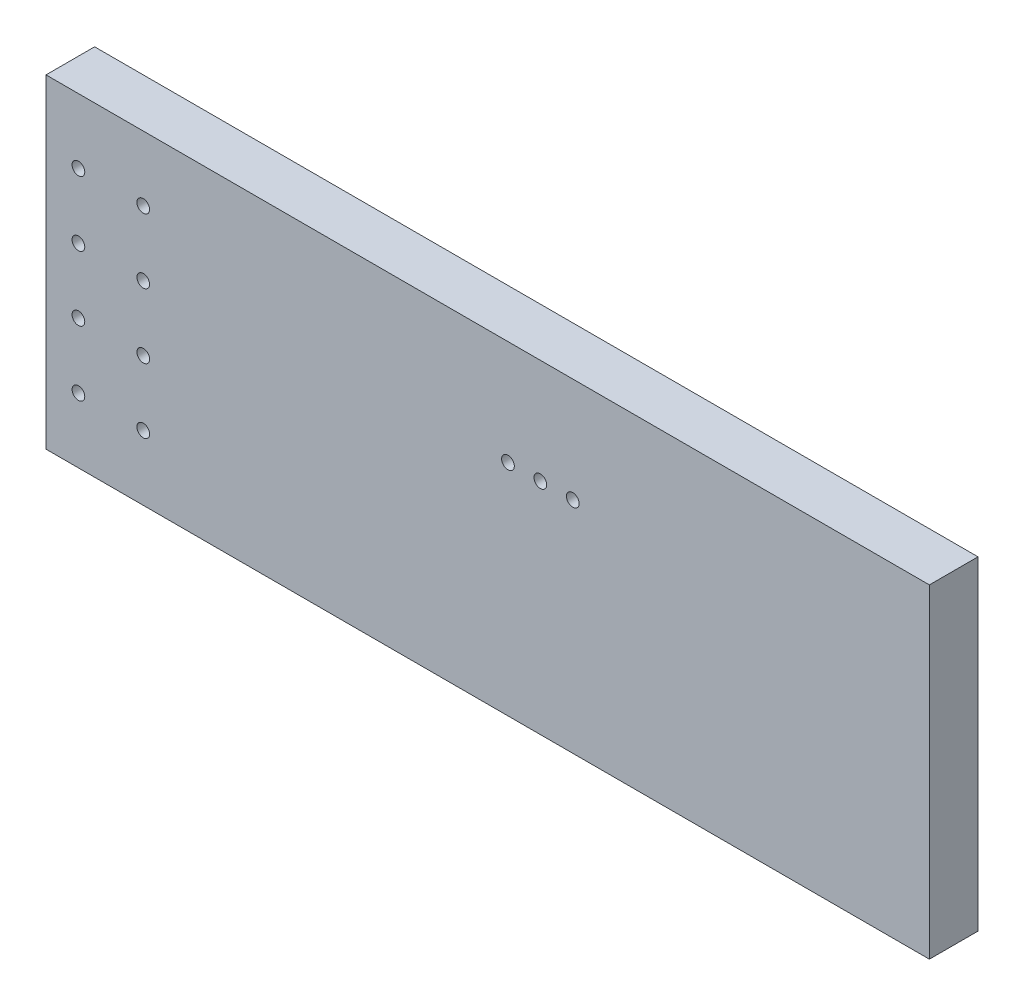
ISO-10303-21;
HEADER;
FILE_DESCRIPTION(('STEP AP214'),'2;1');
FILE_NAME('part.step','',(''),(''),'','','');
FILE_SCHEMA(('AUTOMOTIVE_DESIGN { 1 0 10303 214 1 1 1 1 }'));
ENDSEC;
DATA;
#1=APPLICATION_CONTEXT('core data for automotive mechanical design processes');
#2=APPLICATION_PROTOCOL_DEFINITION('international standard','automotive_design',2000,#1);
#3=PRODUCT_CONTEXT('',#1,'mechanical');
#4=PRODUCT('Part','Part','',(#3));
#5=PRODUCT_RELATED_PRODUCT_CATEGORY('part','',(#4));
#6=PRODUCT_DEFINITION_FORMATION('','',#4);
#7=PRODUCT_DEFINITION_CONTEXT('part definition',#1,'design');
#8=PRODUCT_DEFINITION('design','',#6,#7);
#9=PRODUCT_DEFINITION_SHAPE('','',#8);
#10=(LENGTH_UNIT() NAMED_UNIT(*) SI_UNIT(.MILLI.,.METRE.));
#11=(NAMED_UNIT(*) PLANE_ANGLE_UNIT() SI_UNIT($,.RADIAN.));
#12=(NAMED_UNIT(*) SI_UNIT($,.STERADIAN.) SOLID_ANGLE_UNIT());
#13=UNCERTAINTY_MEASURE_WITH_UNIT(LENGTH_MEASURE(1.E-05),#10,'distance_accuracy_value','');
#14=(GEOMETRIC_REPRESENTATION_CONTEXT(3) GLOBAL_UNCERTAINTY_ASSIGNED_CONTEXT((#13)) GLOBAL_UNIT_ASSIGNED_CONTEXT((#10,
#11,#12)) REPRESENTATION_CONTEXT('',''));
#15=CARTESIAN_POINT('',(0.,0.,0.));
#16=DIRECTION('',(0.,0.,1.));
#17=DIRECTION('',(1.,0.,0.));
#18=AXIS2_PLACEMENT_3D('',#15,#16,#17);
#19=CARTESIAN_POINT('',(0.,0.,19.05));
#20=DIRECTION('',(0.,1.,0.));
#21=DIRECTION('',(0.,0.,1.));
#22=AXIS2_PLACEMENT_3D('',#19,#20,#21);
#23=PLANE('',#22);
#24=DIRECTION('',(1.,0.,0.));
#25=VECTOR('',#24,1.);
#26=CARTESIAN_POINT('',(0.,0.,0.));
#27=LINE('',#26,#25);
#28=CARTESIAN_POINT('',(0.,0.,0.));
#29=VERTEX_POINT('',#28);
#30=CARTESIAN_POINT('',(346.075,0.,0.));
#31=VERTEX_POINT('',#30);
#32=EDGE_CURVE('E83',#29,#31,#27,.T.);
#33=ORIENTED_EDGE('',*,*,#32,.T.);
#34=DIRECTION('',(0.,0.,1.));
#35=VECTOR('',#34,1.);
#36=CARTESIAN_POINT('',(346.075,0.,0.));
#37=LINE('',#36,#35);
#38=CARTESIAN_POINT('',(346.075,0.,19.05));
#39=VERTEX_POINT('',#38);
#40=EDGE_CURVE('E63',#31,#39,#37,.T.);
#41=ORIENTED_EDGE('',*,*,#40,.T.);
#42=DIRECTION('',(1.,0.,0.));
#43=VECTOR('',#42,1.);
#44=CARTESIAN_POINT('',(0.,0.,19.05));
#45=LINE('',#44,#43);
#46=CARTESIAN_POINT('',(0.,0.,19.05));
#47=VERTEX_POINT('',#46);
#48=EDGE_CURVE('E85',#47,#39,#45,.T.);
#49=ORIENTED_EDGE('',*,*,#48,.F.);
#50=DIRECTION('',(0.,0.,-1.));
#51=VECTOR('',#50,1.);
#52=CARTESIAN_POINT('',(0.,0.,19.05));
#53=LINE('',#52,#51);
#54=EDGE_CURVE('E55',#47,#29,#53,.T.);
#55=ORIENTED_EDGE('',*,*,#54,.T.);
#56=EDGE_LOOP('',(#33,#41,#49,#55));
#57=FACE_BOUND('',#56,.T.);
#58=ADVANCED_FACE('F46',(#57),#23,.F.);
#59=CARTESIAN_POINT('',(0.,127.,19.05));
#60=DIRECTION('',(0.,1.,0.));
#61=DIRECTION('',(0.,0.,1.));
#62=AXIS2_PLACEMENT_3D('',#59,#60,#61);
#63=PLANE('',#62);
#64=DIRECTION('',(0.,0.,1.));
#65=VECTOR('',#64,1.);
#66=CARTESIAN_POINT('',(346.075,127.,0.));
#67=LINE('',#66,#65);
#68=CARTESIAN_POINT('',(346.075,127.,0.));
#69=VERTEX_POINT('',#68);
#70=CARTESIAN_POINT('',(346.075,127.,19.05));
#71=VERTEX_POINT('',#70);
#72=EDGE_CURVE('E243',#69,#71,#67,.T.);
#73=ORIENTED_EDGE('',*,*,#72,.F.);
#74=DIRECTION('',(1.,0.,0.));
#75=VECTOR('',#74,1.);
#76=CARTESIAN_POINT('',(0.,127.,0.));
#77=LINE('',#76,#75);
#78=CARTESIAN_POINT('',(0.,127.,0.));
#79=VERTEX_POINT('',#78);
#80=EDGE_CURVE('E97',#79,#69,#77,.T.);
#81=ORIENTED_EDGE('',*,*,#80,.F.);
#82=DIRECTION('',(0.,0.,-1.));
#83=VECTOR('',#82,1.);
#84=CARTESIAN_POINT('',(0.,127.,19.05));
#85=LINE('',#84,#83);
#86=CARTESIAN_POINT('',(0.,127.,19.05));
#87=VERTEX_POINT('',#86);
#88=EDGE_CURVE('E11',#87,#79,#85,.T.);
#89=ORIENTED_EDGE('',*,*,#88,.F.);
#90=DIRECTION('',(1.,0.,0.));
#91=VECTOR('',#90,1.);
#92=CARTESIAN_POINT('',(0.,127.,19.05));
#93=LINE('',#92,#91);
#94=EDGE_CURVE('E106',#87,#71,#93,.T.);
#95=ORIENTED_EDGE('',*,*,#94,.T.);
#96=EDGE_LOOP('',(#73,#81,#89,#95));
#97=FACE_BOUND('',#96,.T.);
#98=ADVANCED_FACE('F165',(#97),#63,.T.);
#99=CARTESIAN_POINT('',(0.,0.,19.05));
#100=DIRECTION('',(-1.,0.,0.));
#101=DIRECTION('',(0.,0.,1.));
#102=AXIS2_PLACEMENT_3D('',#99,#100,#101);
#103=PLANE('',#102);
#104=DIRECTION('',(0.,1.,0.));
#105=VECTOR('',#104,1.);
#106=CARTESIAN_POINT('',(0.,0.,0.));
#107=LINE('',#106,#105);
#108=EDGE_CURVE('E94',#29,#79,#107,.T.);
#109=ORIENTED_EDGE('',*,*,#108,.F.);
#110=ORIENTED_EDGE('',*,*,#54,.F.);
#111=DIRECTION('',(0.,1.,0.));
#112=VECTOR('',#111,1.);
#113=CARTESIAN_POINT('',(0.,0.,19.05));
#114=LINE('',#113,#112);
#115=EDGE_CURVE('E88',#47,#87,#114,.T.);
#116=ORIENTED_EDGE('',*,*,#115,.T.);
#117=ORIENTED_EDGE('',*,*,#88,.T.);
#118=EDGE_LOOP('',(#109,#110,#116,#117));
#119=FACE_BOUND('',#118,.T.);
#120=ADVANCED_FACE('F99',(#119),#103,.T.);
#121=CARTESIAN_POINT('',(0.,0.,19.05));
#122=DIRECTION('',(0.,0.,1.));
#123=DIRECTION('',(1.,0.,0.));
#124=AXIS2_PLACEMENT_3D('',#121,#122,#123);
#125=PLANE('',#124);
#126=DIRECTION('',(0.,-1.,0.));
#127=VECTOR('',#126,1.);
#128=CARTESIAN_POINT('',(346.075,127.,19.05));
#129=LINE('',#128,#127);
#130=EDGE_CURVE('E241',#71,#39,#129,.T.);
#131=ORIENTED_EDGE('',*,*,#130,.F.);
#132=ORIENTED_EDGE('',*,*,#94,.F.);
#133=ORIENTED_EDGE('',*,*,#115,.F.);
#134=ORIENTED_EDGE('',*,*,#48,.T.);
#135=EDGE_LOOP('',(#131,#132,#133,#134));
#136=FACE_BOUND('',#135,.T.);
#137=CARTESIAN_POINT('',(180.975,85.979,19.05));
#138=DIRECTION('',(0.,0.,1.));
#139=DIRECTION('',(1.,0.,0.));
#140=AXIS2_PLACEMENT_3D('',#137,#138,#139);
#141=CIRCLE('',#140,2.4892);
#142=CARTESIAN_POINT('',(183.4642,85.979,19.05));
#143=VERTEX_POINT('',#142);
#144=EDGE_CURVE('E263',#143,#143,#141,.T.);
#145=ORIENTED_EDGE('',*,*,#144,.F.);
#146=EDGE_LOOP('',(#145));
#147=FACE_BOUND('',#146,.T.);
#148=CARTESIAN_POINT('',(193.675,85.979,19.05));
#149=DIRECTION('',(0.,0.,1.));
#150=DIRECTION('',(1.,0.,0.));
#151=AXIS2_PLACEMENT_3D('',#148,#149,#150);
#152=CIRCLE('',#151,2.4892);
#153=CARTESIAN_POINT('',(196.1642,85.979,19.05));
#154=VERTEX_POINT('',#153);
#155=EDGE_CURVE('E267',#154,#154,#152,.T.);
#156=ORIENTED_EDGE('',*,*,#155,.F.);
#157=EDGE_LOOP('',(#156));
#158=FACE_BOUND('',#157,.T.);
#159=CARTESIAN_POINT('',(206.375,85.979,19.05));
#160=DIRECTION('',(0.,0.,1.));
#161=DIRECTION('',(1.,0.,0.));
#162=AXIS2_PLACEMENT_3D('',#159,#160,#161);
#163=CIRCLE('',#162,2.4892);
#164=CARTESIAN_POINT('',(208.8642,85.979,19.05));
#165=VERTEX_POINT('',#164);
#166=EDGE_CURVE('E275',#165,#165,#163,.T.);
#167=ORIENTED_EDGE('',*,*,#166,.F.);
#168=EDGE_LOOP('',(#167));
#169=FACE_BOUND('',#168,.T.);
#170=CARTESIAN_POINT('',(38.1,25.4,19.05));
#171=DIRECTION('',(0.,0.,1.));
#172=DIRECTION('',(1.,0.,0.));
#173=AXIS2_PLACEMENT_3D('',#170,#171,#172);
#174=CIRCLE('',#173,2.4892);
#175=CARTESIAN_POINT('',(40.5892,25.4,19.05));
#176=VERTEX_POINT('',#175);
#177=EDGE_CURVE('E229',#176,#176,#174,.T.);
#178=ORIENTED_EDGE('',*,*,#177,.F.);
#179=EDGE_LOOP('',(#178));
#180=FACE_BOUND('',#179,.T.);
#181=CARTESIAN_POINT('',(12.7,76.2,19.05));
#182=DIRECTION('',(0.,0.,1.));
#183=DIRECTION('',(1.,0.,0.));
#184=AXIS2_PLACEMENT_3D('',#181,#182,#183);
#185=CIRCLE('',#184,2.4892);
#186=CARTESIAN_POINT('',(15.1892,76.2,19.05));
#187=VERTEX_POINT('',#186);
#188=EDGE_CURVE('E224',#187,#187,#185,.T.);
#189=ORIENTED_EDGE('',*,*,#188,.F.);
#190=EDGE_LOOP('',(#189));
#191=FACE_BOUND('',#190,.T.);
#192=CARTESIAN_POINT('',(12.7,50.8,19.05));
#193=DIRECTION('',(0.,0.,1.));
#194=DIRECTION('',(1.,0.,0.));
#195=AXIS2_PLACEMENT_3D('',#192,#193,#194);
#196=CIRCLE('',#195,2.48919999999999);
#197=CARTESIAN_POINT('',(15.1892,50.8,19.05));
#198=VERTEX_POINT('',#197);
#199=EDGE_CURVE('E282',#198,#198,#196,.T.);
#200=ORIENTED_EDGE('',*,*,#199,.F.);
#201=EDGE_LOOP('',(#200));
#202=FACE_BOUND('',#201,.T.);
#203=CARTESIAN_POINT('',(12.7,25.4,19.05));
#204=DIRECTION('',(0.,0.,1.));
#205=DIRECTION('',(1.,0.,0.));
#206=AXIS2_PLACEMENT_3D('',#203,#204,#205);
#207=CIRCLE('',#206,2.4892);
#208=CARTESIAN_POINT('',(15.1892,25.4,19.05));
#209=VERTEX_POINT('',#208);
#210=EDGE_CURVE('E262',#209,#209,#207,.T.);
#211=ORIENTED_EDGE('',*,*,#210,.F.);
#212=EDGE_LOOP('',(#211));
#213=FACE_BOUND('',#212,.T.);
#214=CARTESIAN_POINT('',(38.1,50.8,19.05));
#215=DIRECTION('',(0.,0.,1.));
#216=DIRECTION('',(1.,0.,0.));
#217=AXIS2_PLACEMENT_3D('',#214,#215,#216);
#218=CIRCLE('',#217,2.4892);
#219=CARTESIAN_POINT('',(40.5892,50.8,19.05));
#220=VERTEX_POINT('',#219);
#221=EDGE_CURVE('E221',#220,#220,#218,.T.);
#222=ORIENTED_EDGE('',*,*,#221,.F.);
#223=EDGE_LOOP('',(#222));
#224=FACE_BOUND('',#223,.T.);
#225=CARTESIAN_POINT('',(38.1,76.2,19.05));
#226=DIRECTION('',(0.,0.,1.));
#227=DIRECTION('',(1.,0.,0.));
#228=AXIS2_PLACEMENT_3D('',#225,#226,#227);
#229=CIRCLE('',#228,2.4892);
#230=CARTESIAN_POINT('',(40.5892,76.2,19.05));
#231=VERTEX_POINT('',#230);
#232=EDGE_CURVE('E213',#231,#231,#229,.T.);
#233=ORIENTED_EDGE('',*,*,#232,.F.);
#234=EDGE_LOOP('',(#233));
#235=FACE_BOUND('',#234,.T.);
#236=CARTESIAN_POINT('',(38.1,101.6,19.05));
#237=DIRECTION('',(0.,0.,1.));
#238=DIRECTION('',(1.,0.,0.));
#239=AXIS2_PLACEMENT_3D('',#236,#237,#238);
#240=CIRCLE('',#239,2.4892);
#241=CARTESIAN_POINT('',(40.5892,101.6,19.05));
#242=VERTEX_POINT('',#241);
#243=EDGE_CURVE('E205',#242,#242,#240,.T.);
#244=ORIENTED_EDGE('',*,*,#243,.F.);
#245=EDGE_LOOP('',(#244));
#246=FACE_BOUND('',#245,.T.);
#247=CARTESIAN_POINT('',(12.7,101.6,19.05));
#248=DIRECTION('',(0.,0.,1.));
#249=DIRECTION('',(1.,0.,0.));
#250=AXIS2_PLACEMENT_3D('',#247,#248,#249);
#251=CIRCLE('',#250,2.48919999999999);
#252=CARTESIAN_POINT('',(15.1892,101.6,19.05));
#253=VERTEX_POINT('',#252);
#254=EDGE_CURVE('E115',#253,#253,#251,.T.);
#255=ORIENTED_EDGE('',*,*,#254,.F.);
#256=EDGE_LOOP('',(#255));
#257=FACE_BOUND('',#256,.T.);
#258=ADVANCED_FACE('F175',(#136,#147,#158,#169,#180,#191,#202,#213,#224,#235,#246,#257),#125,.T.);
#259=CARTESIAN_POINT('',(0.,0.,0.));
#260=DIRECTION('',(0.,0.,1.));
#261=DIRECTION('',(1.,0.,0.));
#262=AXIS2_PLACEMENT_3D('',#259,#260,#261);
#263=PLANE('',#262);
#264=CARTESIAN_POINT('',(180.975,85.979,0.));
#265=DIRECTION('',(0.,0.,1.));
#266=DIRECTION('',(1.,0.,0.));
#267=AXIS2_PLACEMENT_3D('',#264,#265,#266);
#268=CIRCLE('',#267,2.4892);
#269=CARTESIAN_POINT('',(183.4642,85.979,0.));
#270=VERTEX_POINT('',#269);
#271=EDGE_CURVE('E258',#270,#270,#268,.T.);
#272=ORIENTED_EDGE('',*,*,#271,.T.);
#273=EDGE_LOOP('',(#272));
#274=FACE_BOUND('',#273,.T.);
#275=CARTESIAN_POINT('',(193.675,85.979,0.));
#276=DIRECTION('',(0.,0.,1.));
#277=DIRECTION('',(1.,0.,0.));
#278=AXIS2_PLACEMENT_3D('',#275,#276,#277);
#279=CIRCLE('',#278,2.4892);
#280=CARTESIAN_POINT('',(196.1642,85.979,0.));
#281=VERTEX_POINT('',#280);
#282=EDGE_CURVE('E271',#281,#281,#279,.T.);
#283=ORIENTED_EDGE('',*,*,#282,.T.);
#284=EDGE_LOOP('',(#283));
#285=FACE_BOUND('',#284,.T.);
#286=CARTESIAN_POINT('',(206.375,85.979,0.));
#287=DIRECTION('',(0.,0.,1.));
#288=DIRECTION('',(1.,0.,0.));
#289=AXIS2_PLACEMENT_3D('',#286,#287,#288);
#290=CIRCLE('',#289,2.4892);
#291=CARTESIAN_POINT('',(208.8642,85.979,0.));
#292=VERTEX_POINT('',#291);
#293=EDGE_CURVE('E256',#292,#292,#290,.T.);
#294=ORIENTED_EDGE('',*,*,#293,.T.);
#295=EDGE_LOOP('',(#294));
#296=FACE_BOUND('',#295,.T.);
#297=CARTESIAN_POINT('',(38.1,25.4,0.));
#298=DIRECTION('',(0.,0.,1.));
#299=DIRECTION('',(1.,0.,0.));
#300=AXIS2_PLACEMENT_3D('',#297,#298,#299);
#301=CIRCLE('',#300,2.4892);
#302=CARTESIAN_POINT('',(40.5892,25.4,0.));
#303=VERTEX_POINT('',#302);
#304=EDGE_CURVE('E49',#303,#303,#301,.T.);
#305=ORIENTED_EDGE('',*,*,#304,.T.);
#306=EDGE_LOOP('',(#305));
#307=FACE_BOUND('',#306,.T.);
#308=CARTESIAN_POINT('',(12.7,76.2,0.));
#309=DIRECTION('',(0.,0.,1.));
#310=DIRECTION('',(1.,0.,0.));
#311=AXIS2_PLACEMENT_3D('',#308,#309,#310);
#312=CIRCLE('',#311,2.4892);
#313=CARTESIAN_POINT('',(15.1892,76.2,0.));
#314=VERTEX_POINT('',#313);
#315=EDGE_CURVE('E134',#314,#314,#312,.T.);
#316=ORIENTED_EDGE('',*,*,#315,.T.);
#317=EDGE_LOOP('',(#316));
#318=FACE_BOUND('',#317,.T.);
#319=CARTESIAN_POINT('',(12.7,50.8,0.));
#320=DIRECTION('',(0.,0.,1.));
#321=DIRECTION('',(1.,0.,0.));
#322=AXIS2_PLACEMENT_3D('',#319,#320,#321);
#323=CIRCLE('',#322,2.48919999999999);
#324=CARTESIAN_POINT('',(15.1892,50.8,0.));
#325=VERTEX_POINT('',#324);
#326=EDGE_CURVE('E131',#325,#325,#323,.T.);
#327=ORIENTED_EDGE('',*,*,#326,.T.);
#328=EDGE_LOOP('',(#327));
#329=FACE_BOUND('',#328,.T.);
#330=CARTESIAN_POINT('',(12.7,25.4,0.));
#331=DIRECTION('',(0.,0.,1.));
#332=DIRECTION('',(1.,0.,0.));
#333=AXIS2_PLACEMENT_3D('',#330,#331,#332);
#334=CIRCLE('',#333,2.4892);
#335=CARTESIAN_POINT('',(15.1892,25.4,0.));
#336=VERTEX_POINT('',#335);
#337=EDGE_CURVE('E127',#336,#336,#334,.T.);
#338=ORIENTED_EDGE('',*,*,#337,.T.);
#339=EDGE_LOOP('',(#338));
#340=FACE_BOUND('',#339,.T.);
#341=CARTESIAN_POINT('',(38.1,50.8,0.));
#342=DIRECTION('',(0.,0.,1.));
#343=DIRECTION('',(1.,0.,0.));
#344=AXIS2_PLACEMENT_3D('',#341,#342,#343);
#345=CIRCLE('',#344,2.4892);
#346=CARTESIAN_POINT('',(40.5892,50.8,0.));
#347=VERTEX_POINT('',#346);
#348=EDGE_CURVE('E123',#347,#347,#345,.T.);
#349=ORIENTED_EDGE('',*,*,#348,.T.);
#350=EDGE_LOOP('',(#349));
#351=FACE_BOUND('',#350,.T.);
#352=CARTESIAN_POINT('',(38.1,76.2,0.));
#353=DIRECTION('',(0.,0.,1.));
#354=DIRECTION('',(1.,0.,0.));
#355=AXIS2_PLACEMENT_3D('',#352,#353,#354);
#356=CIRCLE('',#355,2.4892);
#357=CARTESIAN_POINT('',(40.5892,76.2,0.));
#358=VERTEX_POINT('',#357);
#359=EDGE_CURVE('E119',#358,#358,#356,.T.);
#360=ORIENTED_EDGE('',*,*,#359,.T.);
#361=EDGE_LOOP('',(#360));
#362=FACE_BOUND('',#361,.T.);
#363=CARTESIAN_POINT('',(38.1,101.6,0.));
#364=DIRECTION('',(0.,0.,1.));
#365=DIRECTION('',(1.,0.,0.));
#366=AXIS2_PLACEMENT_3D('',#363,#364,#365);
#367=CIRCLE('',#366,2.4892);
#368=CARTESIAN_POINT('',(40.5892,101.6,0.));
#369=VERTEX_POINT('',#368);
#370=EDGE_CURVE('E114',#369,#369,#367,.T.);
#371=ORIENTED_EDGE('',*,*,#370,.T.);
#372=EDGE_LOOP('',(#371));
#373=FACE_BOUND('',#372,.T.);
#374=CARTESIAN_POINT('',(12.7,101.6,0.));
#375=DIRECTION('',(0.,0.,1.));
#376=DIRECTION('',(1.,0.,0.));
#377=AXIS2_PLACEMENT_3D('',#374,#375,#376);
#378=CIRCLE('',#377,2.48919999999999);
#379=CARTESIAN_POINT('',(15.1892,101.6,0.));
#380=VERTEX_POINT('',#379);
#381=EDGE_CURVE('E110',#380,#380,#378,.T.);
#382=ORIENTED_EDGE('',*,*,#381,.T.);
#383=EDGE_LOOP('',(#382));
#384=FACE_BOUND('',#383,.T.);
#385=ORIENTED_EDGE('',*,*,#80,.T.);
#386=DIRECTION('',(0.,-1.,0.));
#387=VECTOR('',#386,1.);
#388=CARTESIAN_POINT('',(346.075,127.,0.));
#389=LINE('',#388,#387);
#390=EDGE_CURVE('E95',#69,#31,#389,.T.);
#391=ORIENTED_EDGE('',*,*,#390,.T.);
#392=ORIENTED_EDGE('',*,*,#32,.F.);
#393=ORIENTED_EDGE('',*,*,#108,.T.);
#394=EDGE_LOOP('',(#385,#391,#392,#393));
#395=FACE_BOUND('',#394,.T.);
#396=ADVANCED_FACE('F93',(#274,#285,#296,#307,#318,#329,#340,#351,#362,#373,#384,#395),#263,.F.);
#397=CARTESIAN_POINT('',(12.7,101.6,-6.35));
#398=DIRECTION('',(0.,0.,1.));
#399=DIRECTION('',(1.,0.,0.));
#400=AXIS2_PLACEMENT_3D('',#397,#398,#399);
#401=CYLINDRICAL_SURFACE('',#400,2.48919999999999);
#402=ORIENTED_EDGE('',*,*,#254,.T.);
#403=EDGE_LOOP('',(#402));
#404=FACE_BOUND('',#403,.T.);
#405=ORIENTED_EDGE('',*,*,#381,.F.);
#406=EDGE_LOOP('',(#405));
#407=FACE_BOUND('',#406,.T.);
#408=ADVANCED_FACE('F181',(#404,#407),#401,.F.);
#409=CARTESIAN_POINT('',(38.1,101.6,-6.35));
#410=DIRECTION('',(0.,0.,1.));
#411=DIRECTION('',(1.,0.,0.));
#412=AXIS2_PLACEMENT_3D('',#409,#410,#411);
#413=CYLINDRICAL_SURFACE('',#412,2.4892);
#414=ORIENTED_EDGE('',*,*,#243,.T.);
#415=EDGE_LOOP('',(#414));
#416=FACE_BOUND('',#415,.T.);
#417=ORIENTED_EDGE('',*,*,#370,.F.);
#418=EDGE_LOOP('',(#417));
#419=FACE_BOUND('',#418,.T.);
#420=ADVANCED_FACE('F187',(#416,#419),#413,.F.);
#421=CARTESIAN_POINT('',(38.1,76.2,-6.35));
#422=DIRECTION('',(0.,0.,1.));
#423=DIRECTION('',(1.,0.,0.));
#424=AXIS2_PLACEMENT_3D('',#421,#422,#423);
#425=CYLINDRICAL_SURFACE('',#424,2.4892);
#426=ORIENTED_EDGE('',*,*,#232,.T.);
#427=EDGE_LOOP('',(#426));
#428=FACE_BOUND('',#427,.T.);
#429=ORIENTED_EDGE('',*,*,#359,.F.);
#430=EDGE_LOOP('',(#429));
#431=FACE_BOUND('',#430,.T.);
#432=ADVANCED_FACE('F193',(#428,#431),#425,.F.);
#433=CARTESIAN_POINT('',(38.1,50.8,-6.35));
#434=DIRECTION('',(0.,0.,1.));
#435=DIRECTION('',(1.,0.,0.));
#436=AXIS2_PLACEMENT_3D('',#433,#434,#435);
#437=CYLINDRICAL_SURFACE('',#436,2.4892);
#438=ORIENTED_EDGE('',*,*,#221,.T.);
#439=EDGE_LOOP('',(#438));
#440=FACE_BOUND('',#439,.T.);
#441=ORIENTED_EDGE('',*,*,#348,.F.);
#442=EDGE_LOOP('',(#441));
#443=FACE_BOUND('',#442,.T.);
#444=ADVANCED_FACE('F189',(#440,#443),#437,.F.);
#445=CARTESIAN_POINT('',(12.7,25.4,-6.35));
#446=DIRECTION('',(0.,0.,1.));
#447=DIRECTION('',(1.,0.,0.));
#448=AXIS2_PLACEMENT_3D('',#445,#446,#447);
#449=CYLINDRICAL_SURFACE('',#448,2.4892);
#450=ORIENTED_EDGE('',*,*,#210,.T.);
#451=EDGE_LOOP('',(#450));
#452=FACE_BOUND('',#451,.T.);
#453=ORIENTED_EDGE('',*,*,#337,.F.);
#454=EDGE_LOOP('',(#453));
#455=FACE_BOUND('',#454,.T.);
#456=ADVANCED_FACE('F192',(#452,#455),#449,.F.);
#457=CARTESIAN_POINT('',(12.7,50.8,-6.35));
#458=DIRECTION('',(0.,0.,1.));
#459=DIRECTION('',(1.,0.,0.));
#460=AXIS2_PLACEMENT_3D('',#457,#458,#459);
#461=CYLINDRICAL_SURFACE('',#460,2.48919999999999);
#462=ORIENTED_EDGE('',*,*,#199,.T.);
#463=EDGE_LOOP('',(#462));
#464=FACE_BOUND('',#463,.T.);
#465=ORIENTED_EDGE('',*,*,#326,.F.);
#466=EDGE_LOOP('',(#465));
#467=FACE_BOUND('',#466,.T.);
#468=ADVANCED_FACE('F159',(#464,#467),#461,.F.);
#469=CARTESIAN_POINT('',(12.7,76.2,-6.35));
#470=DIRECTION('',(0.,0.,1.));
#471=DIRECTION('',(1.,0.,0.));
#472=AXIS2_PLACEMENT_3D('',#469,#470,#471);
#473=CYLINDRICAL_SURFACE('',#472,2.4892);
#474=ORIENTED_EDGE('',*,*,#188,.T.);
#475=EDGE_LOOP('',(#474));
#476=FACE_BOUND('',#475,.T.);
#477=ORIENTED_EDGE('',*,*,#315,.F.);
#478=EDGE_LOOP('',(#477));
#479=FACE_BOUND('',#478,.T.);
#480=ADVANCED_FACE('F149',(#476,#479),#473,.F.);
#481=CARTESIAN_POINT('',(38.1,25.4,-6.35));
#482=DIRECTION('',(0.,0.,1.));
#483=DIRECTION('',(1.,0.,0.));
#484=AXIS2_PLACEMENT_3D('',#481,#482,#483);
#485=CYLINDRICAL_SURFACE('',#484,2.4892);
#486=ORIENTED_EDGE('',*,*,#177,.T.);
#487=EDGE_LOOP('',(#486));
#488=FACE_BOUND('',#487,.T.);
#489=ORIENTED_EDGE('',*,*,#304,.F.);
#490=EDGE_LOOP('',(#489));
#491=FACE_BOUND('',#490,.T.);
#492=ADVANCED_FACE('F146',(#488,#491),#485,.F.);
#493=CARTESIAN_POINT('',(206.375,85.979,0.));
#494=DIRECTION('',(0.,0.,1.));
#495=DIRECTION('',(1.,0.,0.));
#496=AXIS2_PLACEMENT_3D('',#493,#494,#495);
#497=CYLINDRICAL_SURFACE('',#496,2.4892);
#498=CARTESIAN_POINT('',(208.8642,85.979,0.));
#499=CARTESIAN_POINT('',(208.8642,85.979,0.1984375));
#500=CARTESIAN_POINT('',(208.8642,85.979,0.396875));
#501=CARTESIAN_POINT('',(208.8642,85.979,0.79375));
#502=CARTESIAN_POINT('',(208.8642,85.979,0.9921875));
#503=CARTESIAN_POINT('',(208.8642,85.979,1.3890625));
#504=CARTESIAN_POINT('',(208.8642,85.979,1.5875));
#505=CARTESIAN_POINT('',(208.8642,85.979,1.984375));
#506=CARTESIAN_POINT('',(208.8642,85.979,2.1828125));
#507=CARTESIAN_POINT('',(208.8642,85.979,2.5796875));
#508=CARTESIAN_POINT('',(208.8642,85.979,2.778125));
#509=CARTESIAN_POINT('',(208.8642,85.979,3.175));
#510=CARTESIAN_POINT('',(208.8642,85.979,3.3734375));
#511=CARTESIAN_POINT('',(208.8642,85.979,3.7703125));
#512=CARTESIAN_POINT('',(208.8642,85.979,3.96875));
#513=CARTESIAN_POINT('',(208.8642,85.979,4.365625));
#514=CARTESIAN_POINT('',(208.8642,85.979,4.5640625));
#515=CARTESIAN_POINT('',(208.8642,85.979,4.9609375));
#516=CARTESIAN_POINT('',(208.8642,85.979,5.159375));
#517=CARTESIAN_POINT('',(208.8642,85.979,5.55625));
#518=CARTESIAN_POINT('',(208.8642,85.979,5.7546875));
#519=CARTESIAN_POINT('',(208.8642,85.979,6.1515625));
#520=CARTESIAN_POINT('',(208.8642,85.979,6.35));
#521=CARTESIAN_POINT('',(208.8642,85.979,6.746875));
#522=CARTESIAN_POINT('',(208.8642,85.979,6.9453125));
#523=CARTESIAN_POINT('',(208.8642,85.979,7.3421875));
#524=CARTESIAN_POINT('',(208.8642,85.979,7.540625));
#525=CARTESIAN_POINT('',(208.8642,85.979,7.9375));
#526=CARTESIAN_POINT('',(208.8642,85.979,8.1359375));
#527=CARTESIAN_POINT('',(208.8642,85.979,8.5328125));
#528=CARTESIAN_POINT('',(208.8642,85.979,8.73125));
#529=CARTESIAN_POINT('',(208.8642,85.979,9.128125));
#530=CARTESIAN_POINT('',(208.8642,85.979,9.3265625));
#531=CARTESIAN_POINT('',(208.8642,85.979,9.7234375));
#532=CARTESIAN_POINT('',(208.8642,85.979,9.921875));
#533=CARTESIAN_POINT('',(208.8642,85.979,10.31875));
#534=CARTESIAN_POINT('',(208.8642,85.979,10.5171875));
#535=CARTESIAN_POINT('',(208.8642,85.979,10.9140625));
#536=CARTESIAN_POINT('',(208.8642,85.979,11.1125));
#537=CARTESIAN_POINT('',(208.8642,85.979,11.509375));
#538=CARTESIAN_POINT('',(208.8642,85.979,11.7078125));
#539=CARTESIAN_POINT('',(208.8642,85.979,12.1046875));
#540=CARTESIAN_POINT('',(208.8642,85.979,12.303125));
#541=CARTESIAN_POINT('',(208.8642,85.979,12.7));
#542=CARTESIAN_POINT('',(208.8642,85.979,12.8984375));
#543=CARTESIAN_POINT('',(208.8642,85.979,13.2953125));
#544=CARTESIAN_POINT('',(208.8642,85.979,13.49375));
#545=CARTESIAN_POINT('',(208.8642,85.979,13.890625));
#546=CARTESIAN_POINT('',(208.8642,85.979,14.0890625));
#547=CARTESIAN_POINT('',(208.8642,85.979,14.4859375));
#548=CARTESIAN_POINT('',(208.8642,85.979,14.684375));
#549=CARTESIAN_POINT('',(208.8642,85.979,15.08125));
#550=CARTESIAN_POINT('',(208.8642,85.979,15.2796875));
#551=CARTESIAN_POINT('',(208.8642,85.979,15.6765625));
#552=CARTESIAN_POINT('',(208.8642,85.979,15.875));
#553=CARTESIAN_POINT('',(208.8642,85.979,16.271875));
#554=CARTESIAN_POINT('',(208.8642,85.979,16.4703125));
#555=CARTESIAN_POINT('',(208.8642,85.979,16.8671875));
#556=CARTESIAN_POINT('',(208.8642,85.979,17.065625));
#557=CARTESIAN_POINT('',(208.8642,85.979,17.4625));
#558=CARTESIAN_POINT('',(208.8642,85.979,17.6609375));
#559=CARTESIAN_POINT('',(208.8642,85.979,18.0578125));
#560=CARTESIAN_POINT('',(208.8642,85.979,18.25625));
#561=CARTESIAN_POINT('',(208.8642,85.979,18.653125));
#562=CARTESIAN_POINT('',(208.8642,85.979,18.8515625));
#563=CARTESIAN_POINT('',(208.8642,85.979,19.05));
#564=B_SPLINE_CURVE_WITH_KNOTS('',3,(#498,#499,#500,#501,#502,#503,#504,#505,#506,#507,#508,
#509,#510,#511,#512,#513,#514,#515,#516,#517,#518,#519,#520,#521,#522,#523,#524,#525,#526,#527,
#528,#529,#530,#531,#532,#533,#534,#535,#536,#537,#538,#539,#540,#541,#542,#543,#544,#545,#546,
#547,#548,#549,#550,#551,#552,#553,#554,#555,#556,#557,#558,#559,#560,#561,#562,#563),
.UNSPECIFIED.,.F.,.F.,(4,2,2,2,2,2,2,2,2,2,2,2,2,2,2,2,2,2,2,2,2,2,2,2,2,2,2,2,2,2,2,2,4),(0.,
0.5953125,1.190625,1.7859375,2.38125,2.9765625,3.571875,4.1671875,4.7625,5.3578125,5.953125,
6.5484375,7.14375,7.7390625,8.334375,8.9296875,9.525,10.1203125,10.715625,11.3109375,11.90625,
12.5015625,13.096875,13.6921875,14.2875,14.8828125,15.478125,16.0734375,16.66875,17.2640625,
17.859375,18.4546875,19.05),.UNSPECIFIED.);
#565=EDGE_CURVE('BSEAM148',#292,#165,#564,.T.);
#566=ORIENTED_EDGE('',*,*,#293,.F.);
#567=ORIENTED_EDGE('',*,*,#166,.T.);
#568=ORIENTED_EDGE('',*,*,#565,.T.);
#569=ORIENTED_EDGE('',*,*,#565,.F.);
#570=EDGE_LOOP('',(#566,#568,#567,#569));
#571=FACE_BOUND('',#570,.T.);
#572=ADVANCED_FACE('F148',(#571),#497,.F.);
#573=CARTESIAN_POINT('',(193.675,85.979,0.));
#574=DIRECTION('',(0.,0.,1.));
#575=DIRECTION('',(1.,0.,0.));
#576=AXIS2_PLACEMENT_3D('',#573,#574,#575);
#577=CYLINDRICAL_SURFACE('',#576,2.4892);
#578=CARTESIAN_POINT('',(196.1642,85.979,0.));
#579=CARTESIAN_POINT('',(196.1642,85.979,0.1984375));
#580=CARTESIAN_POINT('',(196.1642,85.979,0.396875));
#581=CARTESIAN_POINT('',(196.1642,85.979,0.79375));
#582=CARTESIAN_POINT('',(196.1642,85.979,0.9921875));
#583=CARTESIAN_POINT('',(196.1642,85.979,1.3890625));
#584=CARTESIAN_POINT('',(196.1642,85.979,1.5875));
#585=CARTESIAN_POINT('',(196.1642,85.979,1.984375));
#586=CARTESIAN_POINT('',(196.1642,85.979,2.1828125));
#587=CARTESIAN_POINT('',(196.1642,85.979,2.5796875));
#588=CARTESIAN_POINT('',(196.1642,85.979,2.778125));
#589=CARTESIAN_POINT('',(196.1642,85.979,3.175));
#590=CARTESIAN_POINT('',(196.1642,85.979,3.3734375));
#591=CARTESIAN_POINT('',(196.1642,85.979,3.7703125));
#592=CARTESIAN_POINT('',(196.1642,85.979,3.96875));
#593=CARTESIAN_POINT('',(196.1642,85.979,4.365625));
#594=CARTESIAN_POINT('',(196.1642,85.979,4.5640625));
#595=CARTESIAN_POINT('',(196.1642,85.979,4.9609375));
#596=CARTESIAN_POINT('',(196.1642,85.979,5.159375));
#597=CARTESIAN_POINT('',(196.1642,85.979,5.55625));
#598=CARTESIAN_POINT('',(196.1642,85.979,5.7546875));
#599=CARTESIAN_POINT('',(196.1642,85.979,6.1515625));
#600=CARTESIAN_POINT('',(196.1642,85.979,6.35));
#601=CARTESIAN_POINT('',(196.1642,85.979,6.746875));
#602=CARTESIAN_POINT('',(196.1642,85.979,6.9453125));
#603=CARTESIAN_POINT('',(196.1642,85.979,7.3421875));
#604=CARTESIAN_POINT('',(196.1642,85.979,7.540625));
#605=CARTESIAN_POINT('',(196.1642,85.979,7.9375));
#606=CARTESIAN_POINT('',(196.1642,85.979,8.1359375));
#607=CARTESIAN_POINT('',(196.1642,85.979,8.5328125));
#608=CARTESIAN_POINT('',(196.1642,85.979,8.73125));
#609=CARTESIAN_POINT('',(196.1642,85.979,9.128125));
#610=CARTESIAN_POINT('',(196.1642,85.979,9.3265625));
#611=CARTESIAN_POINT('',(196.1642,85.979,9.7234375));
#612=CARTESIAN_POINT('',(196.1642,85.979,9.921875));
#613=CARTESIAN_POINT('',(196.1642,85.979,10.31875));
#614=CARTESIAN_POINT('',(196.1642,85.979,10.5171875));
#615=CARTESIAN_POINT('',(196.1642,85.979,10.9140625));
#616=CARTESIAN_POINT('',(196.1642,85.979,11.1125));
#617=CARTESIAN_POINT('',(196.1642,85.979,11.509375));
#618=CARTESIAN_POINT('',(196.1642,85.979,11.7078125));
#619=CARTESIAN_POINT('',(196.1642,85.979,12.1046875));
#620=CARTESIAN_POINT('',(196.1642,85.979,12.303125));
#621=CARTESIAN_POINT('',(196.1642,85.979,12.7));
#622=CARTESIAN_POINT('',(196.1642,85.979,12.8984375));
#623=CARTESIAN_POINT('',(196.1642,85.979,13.2953125));
#624=CARTESIAN_POINT('',(196.1642,85.979,13.49375));
#625=CARTESIAN_POINT('',(196.1642,85.979,13.890625));
#626=CARTESIAN_POINT('',(196.1642,85.979,14.0890625));
#627=CARTESIAN_POINT('',(196.1642,85.979,14.4859375));
#628=CARTESIAN_POINT('',(196.1642,85.979,14.684375));
#629=CARTESIAN_POINT('',(196.1642,85.979,15.08125));
#630=CARTESIAN_POINT('',(196.1642,85.979,15.2796875));
#631=CARTESIAN_POINT('',(196.1642,85.979,15.6765625));
#632=CARTESIAN_POINT('',(196.1642,85.979,15.875));
#633=CARTESIAN_POINT('',(196.1642,85.979,16.271875));
#634=CARTESIAN_POINT('',(196.1642,85.979,16.4703125));
#635=CARTESIAN_POINT('',(196.1642,85.979,16.8671875));
#636=CARTESIAN_POINT('',(196.1642,85.979,17.065625));
#637=CARTESIAN_POINT('',(196.1642,85.979,17.4625));
#638=CARTESIAN_POINT('',(196.1642,85.979,17.6609375));
#639=CARTESIAN_POINT('',(196.1642,85.979,18.0578125));
#640=CARTESIAN_POINT('',(196.1642,85.979,18.25625));
#641=CARTESIAN_POINT('',(196.1642,85.979,18.653125));
#642=CARTESIAN_POINT('',(196.1642,85.979,18.8515625));
#643=CARTESIAN_POINT('',(196.1642,85.979,19.05));
#644=B_SPLINE_CURVE_WITH_KNOTS('',3,(#578,#579,#580,#581,#582,#583,#584,#585,#586,#587,#588,
#589,#590,#591,#592,#593,#594,#595,#596,#597,#598,#599,#600,#601,#602,#603,#604,#605,#606,#607,
#608,#609,#610,#611,#612,#613,#614,#615,#616,#617,#618,#619,#620,#621,#622,#623,#624,#625,#626,
#627,#628,#629,#630,#631,#632,#633,#634,#635,#636,#637,#638,#639,#640,#641,#642,#643),
.UNSPECIFIED.,.F.,.F.,(4,2,2,2,2,2,2,2,2,2,2,2,2,2,2,2,2,2,2,2,2,2,2,2,2,2,2,2,2,2,2,2,4),(0.,
0.5953125,1.190625,1.7859375,2.38125,2.9765625,3.571875,4.1671875,4.7625,5.3578125,5.953125,
6.5484375,7.14375,7.7390625,8.334375,8.9296875,9.525,10.1203125,10.715625,11.3109375,11.90625,
12.5015625,13.096875,13.6921875,14.2875,14.8828125,15.478125,16.0734375,16.66875,17.2640625,
17.859375,18.4546875,19.05),.UNSPECIFIED.);
#645=EDGE_CURVE('BSEAM156',#281,#154,#644,.T.);
#646=ORIENTED_EDGE('',*,*,#282,.F.);
#647=ORIENTED_EDGE('',*,*,#155,.T.);
#648=ORIENTED_EDGE('',*,*,#645,.T.);
#649=ORIENTED_EDGE('',*,*,#645,.F.);
#650=EDGE_LOOP('',(#646,#648,#647,#649));
#651=FACE_BOUND('',#650,.T.);
#652=ADVANCED_FACE('F156',(#651),#577,.F.);
#653=CARTESIAN_POINT('',(180.975,85.979,0.));
#654=DIRECTION('',(0.,0.,1.));
#655=DIRECTION('',(1.,0.,0.));
#656=AXIS2_PLACEMENT_3D('',#653,#654,#655);
#657=CYLINDRICAL_SURFACE('',#656,2.4892);
#658=CARTESIAN_POINT('',(183.4642,85.979,0.));
#659=CARTESIAN_POINT('',(183.4642,85.979,0.1984375));
#660=CARTESIAN_POINT('',(183.4642,85.979,0.396875));
#661=CARTESIAN_POINT('',(183.4642,85.979,0.79375));
#662=CARTESIAN_POINT('',(183.4642,85.979,0.9921875));
#663=CARTESIAN_POINT('',(183.4642,85.979,1.3890625));
#664=CARTESIAN_POINT('',(183.4642,85.979,1.5875));
#665=CARTESIAN_POINT('',(183.4642,85.979,1.984375));
#666=CARTESIAN_POINT('',(183.4642,85.979,2.1828125));
#667=CARTESIAN_POINT('',(183.4642,85.979,2.5796875));
#668=CARTESIAN_POINT('',(183.4642,85.979,2.778125));
#669=CARTESIAN_POINT('',(183.4642,85.979,3.175));
#670=CARTESIAN_POINT('',(183.4642,85.979,3.3734375));
#671=CARTESIAN_POINT('',(183.4642,85.979,3.7703125));
#672=CARTESIAN_POINT('',(183.4642,85.979,3.96875));
#673=CARTESIAN_POINT('',(183.4642,85.979,4.365625));
#674=CARTESIAN_POINT('',(183.4642,85.979,4.5640625));
#675=CARTESIAN_POINT('',(183.4642,85.979,4.9609375));
#676=CARTESIAN_POINT('',(183.4642,85.979,5.159375));
#677=CARTESIAN_POINT('',(183.4642,85.979,5.55625));
#678=CARTESIAN_POINT('',(183.4642,85.979,5.7546875));
#679=CARTESIAN_POINT('',(183.4642,85.979,6.1515625));
#680=CARTESIAN_POINT('',(183.4642,85.979,6.35));
#681=CARTESIAN_POINT('',(183.4642,85.979,6.746875));
#682=CARTESIAN_POINT('',(183.4642,85.979,6.9453125));
#683=CARTESIAN_POINT('',(183.4642,85.979,7.3421875));
#684=CARTESIAN_POINT('',(183.4642,85.979,7.540625));
#685=CARTESIAN_POINT('',(183.4642,85.979,7.9375));
#686=CARTESIAN_POINT('',(183.4642,85.979,8.1359375));
#687=CARTESIAN_POINT('',(183.4642,85.979,8.5328125));
#688=CARTESIAN_POINT('',(183.4642,85.979,8.73125));
#689=CARTESIAN_POINT('',(183.4642,85.979,9.128125));
#690=CARTESIAN_POINT('',(183.4642,85.979,9.3265625));
#691=CARTESIAN_POINT('',(183.4642,85.979,9.7234375));
#692=CARTESIAN_POINT('',(183.4642,85.979,9.921875));
#693=CARTESIAN_POINT('',(183.4642,85.979,10.31875));
#694=CARTESIAN_POINT('',(183.4642,85.979,10.5171875));
#695=CARTESIAN_POINT('',(183.4642,85.979,10.9140625));
#696=CARTESIAN_POINT('',(183.4642,85.979,11.1125));
#697=CARTESIAN_POINT('',(183.4642,85.979,11.509375));
#698=CARTESIAN_POINT('',(183.4642,85.979,11.7078125));
#699=CARTESIAN_POINT('',(183.4642,85.979,12.1046875));
#700=CARTESIAN_POINT('',(183.4642,85.979,12.303125));
#701=CARTESIAN_POINT('',(183.4642,85.979,12.7));
#702=CARTESIAN_POINT('',(183.4642,85.979,12.8984375));
#703=CARTESIAN_POINT('',(183.4642,85.979,13.2953125));
#704=CARTESIAN_POINT('',(183.4642,85.979,13.49375));
#705=CARTESIAN_POINT('',(183.4642,85.979,13.890625));
#706=CARTESIAN_POINT('',(183.4642,85.979,14.0890625));
#707=CARTESIAN_POINT('',(183.4642,85.979,14.4859375));
#708=CARTESIAN_POINT('',(183.4642,85.979,14.684375));
#709=CARTESIAN_POINT('',(183.4642,85.979,15.08125));
#710=CARTESIAN_POINT('',(183.4642,85.979,15.2796875));
#711=CARTESIAN_POINT('',(183.4642,85.979,15.6765625));
#712=CARTESIAN_POINT('',(183.4642,85.979,15.875));
#713=CARTESIAN_POINT('',(183.4642,85.979,16.271875));
#714=CARTESIAN_POINT('',(183.4642,85.979,16.4703125));
#715=CARTESIAN_POINT('',(183.4642,85.979,16.8671875));
#716=CARTESIAN_POINT('',(183.4642,85.979,17.065625));
#717=CARTESIAN_POINT('',(183.4642,85.979,17.4625));
#718=CARTESIAN_POINT('',(183.4642,85.979,17.6609375));
#719=CARTESIAN_POINT('',(183.4642,85.979,18.0578125));
#720=CARTESIAN_POINT('',(183.4642,85.979,18.25625));
#721=CARTESIAN_POINT('',(183.4642,85.979,18.653125));
#722=CARTESIAN_POINT('',(183.4642,85.979,18.8515625));
#723=CARTESIAN_POINT('',(183.4642,85.979,19.05));
#724=B_SPLINE_CURVE_WITH_KNOTS('',3,(#658,#659,#660,#661,#662,#663,#664,#665,#666,#667,#668,
#669,#670,#671,#672,#673,#674,#675,#676,#677,#678,#679,#680,#681,#682,#683,#684,#685,#686,#687,
#688,#689,#690,#691,#692,#693,#694,#695,#696,#697,#698,#699,#700,#701,#702,#703,#704,#705,#706,
#707,#708,#709,#710,#711,#712,#713,#714,#715,#716,#717,#718,#719,#720,#721,#722,#723),
.UNSPECIFIED.,.F.,.F.,(4,2,2,2,2,2,2,2,2,2,2,2,2,2,2,2,2,2,2,2,2,2,2,2,2,2,2,2,2,2,2,2,4),(0.,
0.5953125,1.190625,1.7859375,2.38125,2.9765625,3.571875,4.1671875,4.7625,5.3578125,5.953125,
6.5484375,7.14375,7.7390625,8.334375,8.9296875,9.525,10.1203125,10.715625,11.3109375,11.90625,
12.5015625,13.096875,13.6921875,14.2875,14.8828125,15.478125,16.0734375,16.66875,17.2640625,
17.859375,18.4546875,19.05),.UNSPECIFIED.);
#725=EDGE_CURVE('BSEAM326',#270,#143,#724,.T.);
#726=ORIENTED_EDGE('',*,*,#271,.F.);
#727=ORIENTED_EDGE('',*,*,#144,.T.);
#728=ORIENTED_EDGE('',*,*,#725,.T.);
#729=ORIENTED_EDGE('',*,*,#725,.F.);
#730=EDGE_LOOP('',(#726,#728,#727,#729));
#731=FACE_BOUND('',#730,.T.);
#732=ADVANCED_FACE('F326',(#731),#657,.F.);
#733=CARTESIAN_POINT('',(346.075,127.,0.));
#734=DIRECTION('',(-1.,0.,0.));
#735=DIRECTION('',(0.,0.,1.));
#736=AXIS2_PLACEMENT_3D('',#733,#734,#735);
#737=PLANE('',#736);
#738=ORIENTED_EDGE('',*,*,#130,.T.);
#739=ORIENTED_EDGE('',*,*,#40,.F.);
#740=ORIENTED_EDGE('',*,*,#390,.F.);
#741=ORIENTED_EDGE('',*,*,#72,.T.);
#742=EDGE_LOOP('',(#738,#739,#740,#741));
#743=FACE_BOUND('',#742,.T.);
#744=ADVANCED_FACE('F246',(#743),#737,.F.);
#745=CLOSED_SHELL('',(#58,#98,#120,#258,#396,#408,#420,#432,#444,#456,#468,#480,#492,#572,#652,
#732,#744));
#746=MANIFOLD_SOLID_BREP('B2',#745);
#747=ADVANCED_BREP_SHAPE_REPRESENTATION('',(#18,#746),#14);
#748=SHAPE_DEFINITION_REPRESENTATION(#9,#747);
ENDSEC;
END-ISO-10303-21;
